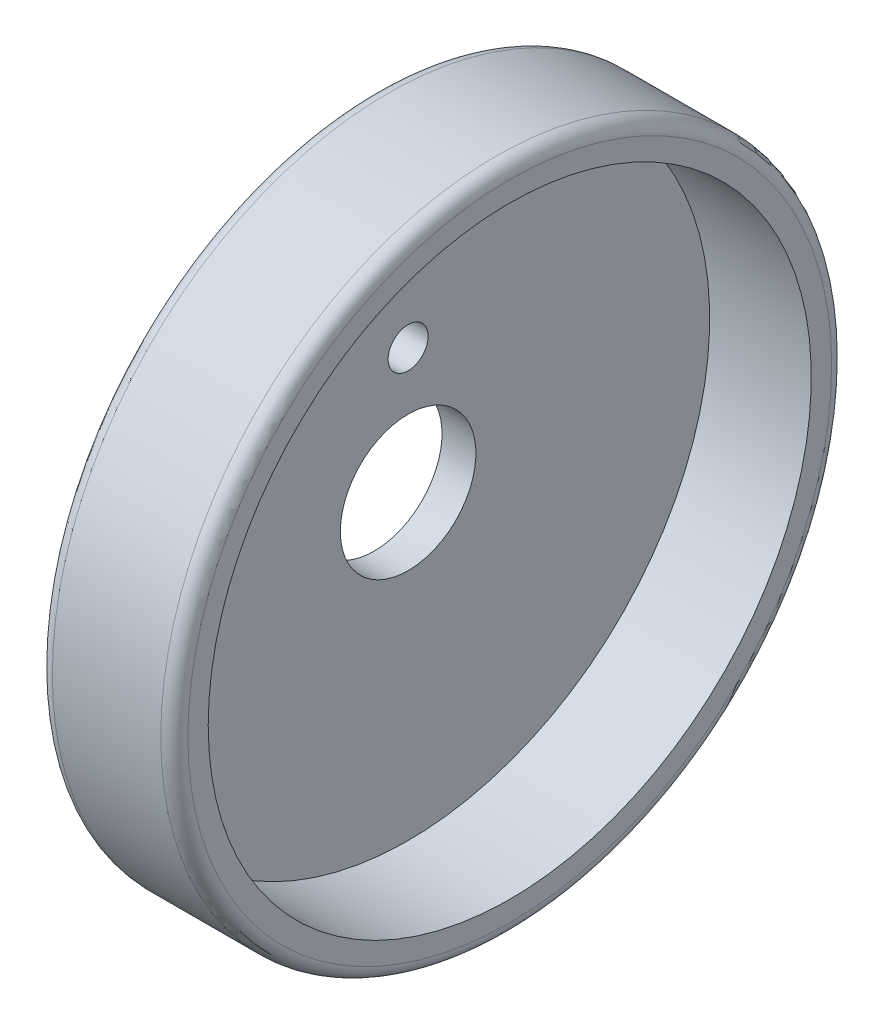
ISO-10303-21;
HEADER;
FILE_DESCRIPTION(('STEP AP214'),'2;1');
FILE_NAME('part.step','',(''),(''),'','','');
FILE_SCHEMA(('AUTOMOTIVE_DESIGN { 1 0 10303 214 1 1 1 1 }'));
ENDSEC;
DATA;
#1=APPLICATION_CONTEXT('core data for automotive mechanical design processes');
#2=APPLICATION_PROTOCOL_DEFINITION('international standard','automotive_design',2000,#1);
#3=PRODUCT_CONTEXT('',#1,'mechanical');
#4=PRODUCT('Part','Part','',(#3));
#5=PRODUCT_RELATED_PRODUCT_CATEGORY('part','',(#4));
#6=PRODUCT_DEFINITION_FORMATION('','',#4);
#7=PRODUCT_DEFINITION_CONTEXT('part definition',#1,'design');
#8=PRODUCT_DEFINITION('design','',#6,#7);
#9=PRODUCT_DEFINITION_SHAPE('','',#8);
#10=(LENGTH_UNIT() NAMED_UNIT(*) SI_UNIT(.MILLI.,.METRE.));
#11=(NAMED_UNIT(*) PLANE_ANGLE_UNIT() SI_UNIT($,.RADIAN.));
#12=(NAMED_UNIT(*) SI_UNIT($,.STERADIAN.) SOLID_ANGLE_UNIT());
#13=UNCERTAINTY_MEASURE_WITH_UNIT(LENGTH_MEASURE(1.E-05),#10,'distance_accuracy_value','');
#14=(GEOMETRIC_REPRESENTATION_CONTEXT(3) GLOBAL_UNCERTAINTY_ASSIGNED_CONTEXT((#13)) GLOBAL_UNIT_ASSIGNED_CONTEXT((#10,
#11,#12)) REPRESENTATION_CONTEXT('',''));
#15=CARTESIAN_POINT('',(0.,0.,0.));
#16=DIRECTION('',(0.,0.,1.));
#17=DIRECTION('',(1.,0.,0.));
#18=AXIS2_PLACEMENT_3D('',#15,#16,#17);
#19=CARTESIAN_POINT('',(-12.309472934473,19.7222222222222,0.));
#20=DIRECTION('',(-1.,0.,0.));
#21=DIRECTION('',(0.,0.,1.));
#22=AXIS2_PLACEMENT_3D('',#19,#20,#21);
#23=PLANE('',#22);
#24=CARTESIAN_POINT('',(-12.309472934473,-29.7777777777778,0.));
#25=DIRECTION('',(-1.,0.,0.));
#26=DIRECTION('',(0.,0.,1.));
#27=AXIS2_PLACEMENT_3D('',#24,#25,#26);
#28=CIRCLE('',#27,47.5);
#29=CARTESIAN_POINT('',(-12.309472934473,-29.7777777777778,47.5));
#30=VERTEX_POINT('',#29);
#31=EDGE_CURVE('E10',#30,#30,#28,.F.);
#32=ORIENTED_EDGE('',*,*,#31,.T.);
#33=EDGE_LOOP('',(#32));
#34=FACE_BOUND('',#33,.T.);
#35=CARTESIAN_POINT('',(-12.309472934473,-29.7777777777778,0.));
#36=DIRECTION('',(-1.,0.,0.));
#37=DIRECTION('',(0.,0.,1.));
#38=AXIS2_PLACEMENT_3D('',#35,#36,#37);
#39=CIRCLE('',#38,44.5);
#40=CARTESIAN_POINT('',(-12.309472934473,-29.7777777777778,44.5));
#41=VERTEX_POINT('',#40);
#42=EDGE_CURVE('E62',#41,#41,#39,.T.);
#43=ORIENTED_EDGE('',*,*,#42,.T.);
#44=EDGE_LOOP('',(#43));
#45=FACE_BOUND('',#44,.T.);
#46=ADVANCED_FACE('F38',(#34,#45),#23,.F.);
#47=CARTESIAN_POINT('',(-53.2788146794937,-29.7777777777778,0.));
#48=DIRECTION('',(-1.,0.,0.));
#49=DIRECTION('',(0.,0.,1.));
#50=AXIS2_PLACEMENT_3D('',#47,#48,#49);
#51=CYLINDRICAL_SURFACE('',#50,44.5);
#52=ORIENTED_EDGE('',*,*,#42,.F.);
#53=EDGE_LOOP('',(#52));
#54=FACE_BOUND('',#53,.T.);
#55=CARTESIAN_POINT('',(-27.309472934473,-29.7777777777778,0.));
#56=DIRECTION('',(-1.,0.,0.));
#57=DIRECTION('',(0.,0.,1.));
#58=AXIS2_PLACEMENT_3D('',#55,#56,#57);
#59=CIRCLE('',#58,44.5);
#60=CARTESIAN_POINT('',(-27.309472934473,-29.7777777777778,44.5));
#61=VERTEX_POINT('',#60);
#62=EDGE_CURVE('E66',#61,#61,#59,.T.);
#63=ORIENTED_EDGE('',*,*,#62,.T.);
#64=EDGE_LOOP('',(#63));
#65=FACE_BOUND('',#64,.T.);
#66=ADVANCED_FACE('F101',(#54,#65),#51,.F.);
#67=CARTESIAN_POINT('',(-27.309472934473,14.7222222222222,0.));
#68=DIRECTION('',(-1.,0.,0.));
#69=DIRECTION('',(0.,0.,1.));
#70=AXIS2_PLACEMENT_3D('',#67,#68,#69);
#71=PLANE('',#70);
#72=CARTESIAN_POINT('',(-27.309472934473,-11.2777777777778,0.));
#73=DIRECTION('',(-1.,0.,0.));
#74=DIRECTION('',(0.,0.,1.));
#75=AXIS2_PLACEMENT_3D('',#72,#73,#74);
#76=CIRCLE('',#75,2.95);
#77=CARTESIAN_POINT('',(-27.309472934473,-11.2777777777778,-2.94999999999998));
#78=VERTEX_POINT('',#77);
#79=EDGE_CURVE('E78',#78,#78,#76,.T.);
#80=ORIENTED_EDGE('',*,*,#79,.T.);
#81=EDGE_LOOP('',(#80));
#82=FACE_BOUND('',#81,.T.);
#83=ORIENTED_EDGE('',*,*,#62,.F.);
#84=EDGE_LOOP('',(#83));
#85=FACE_BOUND('',#84,.T.);
#86=CARTESIAN_POINT('',(-27.309472934473,-29.7777777777778,0.));
#87=DIRECTION('',(-1.,0.,0.));
#88=DIRECTION('',(0.,0.,1.));
#89=AXIS2_PLACEMENT_3D('',#86,#87,#88);
#90=CIRCLE('',#89,10.);
#91=CARTESIAN_POINT('',(-27.309472934473,-29.7777777777778,10.));
#92=VERTEX_POINT('',#91);
#93=EDGE_CURVE('E70',#92,#92,#90,.T.);
#94=ORIENTED_EDGE('',*,*,#93,.T.);
#95=EDGE_LOOP('',(#94));
#96=FACE_BOUND('',#95,.T.);
#97=ADVANCED_FACE('F106',(#82,#85,#96),#71,.F.);
#98=CARTESIAN_POINT('',(-53.2788146794937,-29.7777777777778,0.));
#99=DIRECTION('',(-1.,0.,0.));
#100=DIRECTION('',(0.,0.,1.));
#101=AXIS2_PLACEMENT_3D('',#98,#99,#100);
#102=CYLINDRICAL_SURFACE('',#101,10.);
#103=ORIENTED_EDGE('',*,*,#93,.F.);
#104=EDGE_LOOP('',(#103));
#105=FACE_BOUND('',#104,.T.);
#106=CARTESIAN_POINT('',(-32.309472934473,-29.7777777777778,0.));
#107=DIRECTION('',(-1.,0.,0.));
#108=DIRECTION('',(0.,0.,1.));
#109=AXIS2_PLACEMENT_3D('',#106,#107,#108);
#110=CIRCLE('',#109,10.);
#111=CARTESIAN_POINT('',(-32.309472934473,-29.7777777777778,10.));
#112=VERTEX_POINT('',#111);
#113=EDGE_CURVE('E74',#112,#112,#110,.T.);
#114=ORIENTED_EDGE('',*,*,#113,.T.);
#115=EDGE_LOOP('',(#114));
#116=FACE_BOUND('',#115,.T.);
#117=ADVANCED_FACE('F123',(#105,#116),#102,.F.);
#118=CARTESIAN_POINT('',(-32.309472934473,-19.7777777777778,0.));
#119=DIRECTION('',(1.,0.,0.));
#120=DIRECTION('',(0.,0.,-1.));
#121=AXIS2_PLACEMENT_3D('',#118,#119,#120);
#122=PLANE('',#121);
#123=CARTESIAN_POINT('',(-32.309472934473,-11.2777777777778,0.));
#124=DIRECTION('',(1.,0.,0.));
#125=DIRECTION('',(0.,0.,-1.));
#126=AXIS2_PLACEMENT_3D('',#123,#124,#125);
#127=CIRCLE('',#126,2.95);
#128=CARTESIAN_POINT('',(-32.309472934473,-11.2777777777778,-2.94999999999998));
#129=VERTEX_POINT('',#128);
#130=EDGE_CURVE('E42',#129,#129,#127,.T.);
#131=ORIENTED_EDGE('',*,*,#130,.T.);
#132=EDGE_LOOP('',(#131));
#133=FACE_BOUND('',#132,.T.);
#134=CARTESIAN_POINT('',(-32.309472934473,-29.7777777777778,0.));
#135=DIRECTION('',(1.,0.,0.));
#136=DIRECTION('',(0.,0.,-1.));
#137=AXIS2_PLACEMENT_3D('',#134,#135,#136);
#138=CIRCLE('',#137,47.5);
#139=CARTESIAN_POINT('',(-32.309472934473,-29.7777777777778,-47.5));
#140=VERTEX_POINT('',#139);
#141=EDGE_CURVE('E58',#140,#140,#138,.F.);
#142=ORIENTED_EDGE('',*,*,#141,.T.);
#143=EDGE_LOOP('',(#142));
#144=FACE_BOUND('',#143,.T.);
#145=ORIENTED_EDGE('',*,*,#113,.F.);
#146=EDGE_LOOP('',(#145));
#147=FACE_BOUND('',#146,.T.);
#148=ADVANCED_FACE('F87',(#133,#144,#147),#122,.F.);
#149=CARTESIAN_POINT('',(-53.2788146794937,-29.7777777777778,0.));
#150=DIRECTION('',(-1.,0.,0.));
#151=DIRECTION('',(0.,0.,1.));
#152=AXIS2_PLACEMENT_3D('',#149,#150,#151);
#153=CYLINDRICAL_SURFACE('',#152,49.5);
#154=CARTESIAN_POINT('',(-14.309472934473,-29.7777777777778,0.));
#155=DIRECTION('',(-1.,0.,0.));
#156=DIRECTION('',(0.,0.,1.));
#157=AXIS2_PLACEMENT_3D('',#154,#155,#156);
#158=CIRCLE('',#157,49.5);
#159=CARTESIAN_POINT('',(-14.309472934473,-29.7777777777778,49.5));
#160=VERTEX_POINT('',#159);
#161=EDGE_CURVE('E47',#160,#160,#158,.T.);
#162=ORIENTED_EDGE('',*,*,#161,.T.);
#163=EDGE_LOOP('',(#162));
#164=FACE_BOUND('',#163,.T.);
#165=CARTESIAN_POINT('',(-30.309472934473,-29.7777777777778,0.));
#166=DIRECTION('',(1.,0.,0.));
#167=DIRECTION('',(0.,0.,-1.));
#168=AXIS2_PLACEMENT_3D('',#165,#166,#167);
#169=CIRCLE('',#168,49.5);
#170=CARTESIAN_POINT('',(-30.309472934473,-29.7777777777778,-49.5));
#171=VERTEX_POINT('',#170);
#172=EDGE_CURVE('E52',#171,#171,#169,.T.);
#173=ORIENTED_EDGE('',*,*,#172,.T.);
#174=EDGE_LOOP('',(#173));
#175=FACE_BOUND('',#174,.T.);
#176=ADVANCED_FACE('F112',(#164,#175),#153,.T.);
#177=CARTESIAN_POINT('',(-30.309472934473,-29.7777777777778,0.));
#178=DIRECTION('',(1.,0.,0.));
#179=DIRECTION('',(0.,0.,-1.));
#180=AXIS2_PLACEMENT_3D('',#177,#178,#179);
#181=TOROIDAL_SURFACE('',#180,47.5,2.);
#182=ORIENTED_EDGE('',*,*,#172,.F.);
#183=EDGE_LOOP('',(#182));
#184=FACE_BOUND('',#183,.T.);
#185=ORIENTED_EDGE('',*,*,#141,.F.);
#186=EDGE_LOOP('',(#185));
#187=FACE_BOUND('',#186,.T.);
#188=ADVANCED_FACE('F97',(#184,#187),#181,.T.);
#189=CARTESIAN_POINT('',(-14.309472934473,-29.7777777777778,0.));
#190=DIRECTION('',(-1.,0.,0.));
#191=DIRECTION('',(0.,0.,1.));
#192=AXIS2_PLACEMENT_3D('',#189,#190,#191);
#193=TOROIDAL_SURFACE('',#192,47.5,2.);
#194=ORIENTED_EDGE('',*,*,#31,.F.);
#195=EDGE_LOOP('',(#194));
#196=FACE_BOUND('',#195,.T.);
#197=ORIENTED_EDGE('',*,*,#161,.F.);
#198=EDGE_LOOP('',(#197));
#199=FACE_BOUND('',#198,.T.);
#200=ADVANCED_FACE('F40',(#196,#199),#193,.T.);
#201=CARTESIAN_POINT('',(-40.309472934473,-11.2777777777778,0.));
#202=DIRECTION('',(1.,0.,0.));
#203=DIRECTION('',(0.,0.,-1.));
#204=AXIS2_PLACEMENT_3D('',#201,#202,#203);
#205=CYLINDRICAL_SURFACE('',#204,2.95);
#206=CARTESIAN_POINT('',(-32.309472934473,-11.2777777777778,-2.94999999999998));
#207=CARTESIAN_POINT('',(-32.2573896011396,-11.2777777777778,-2.94999999999998));
#208=CARTESIAN_POINT('',(-32.2053062678063,-11.2777777777778,-2.94999999999998));
#209=CARTESIAN_POINT('',(-32.1011396011396,-11.2777777777778,-2.94999999999998));
#210=CARTESIAN_POINT('',(-32.0490562678063,-11.2777777777778,-2.94999999999998));
#211=CARTESIAN_POINT('',(-31.9448896011396,-11.2777777777778,-2.94999999999998));
#212=CARTESIAN_POINT('',(-31.8928062678063,-11.2777777777778,-2.94999999999998));
#213=CARTESIAN_POINT('',(-31.7886396011396,-11.2777777777778,-2.94999999999998));
#214=CARTESIAN_POINT('',(-31.7365562678063,-11.2777777777778,-2.94999999999998));
#215=CARTESIAN_POINT('',(-31.6323896011396,-11.2777777777778,-2.94999999999998));
#216=CARTESIAN_POINT('',(-31.5803062678063,-11.2777777777778,-2.94999999999998));
#217=CARTESIAN_POINT('',(-31.4761396011396,-11.2777777777778,-2.94999999999998));
#218=CARTESIAN_POINT('',(-31.4240562678063,-11.2777777777778,-2.94999999999998));
#219=CARTESIAN_POINT('',(-31.3198896011396,-11.2777777777778,-2.94999999999998));
#220=CARTESIAN_POINT('',(-31.2678062678063,-11.2777777777778,-2.94999999999998));
#221=CARTESIAN_POINT('',(-31.1636396011396,-11.2777777777778,-2.94999999999998));
#222=CARTESIAN_POINT('',(-31.1115562678063,-11.2777777777778,-2.94999999999998));
#223=CARTESIAN_POINT('',(-31.0073896011396,-11.2777777777778,-2.94999999999998));
#224=CARTESIAN_POINT('',(-30.9553062678063,-11.2777777777778,-2.94999999999998));
#225=CARTESIAN_POINT('',(-30.8511396011396,-11.2777777777778,-2.94999999999998));
#226=CARTESIAN_POINT('',(-30.7990562678063,-11.2777777777778,-2.94999999999998));
#227=CARTESIAN_POINT('',(-30.6948896011396,-11.2777777777778,-2.94999999999998));
#228=CARTESIAN_POINT('',(-30.6428062678063,-11.2777777777778,-2.94999999999998));
#229=CARTESIAN_POINT('',(-30.5386396011396,-11.2777777777778,-2.94999999999998));
#230=CARTESIAN_POINT('',(-30.4865562678063,-11.2777777777778,-2.94999999999998));
#231=CARTESIAN_POINT('',(-30.3823896011396,-11.2777777777778,-2.94999999999998));
#232=CARTESIAN_POINT('',(-30.3303062678063,-11.2777777777778,-2.94999999999998));
#233=CARTESIAN_POINT('',(-30.2261396011396,-11.2777777777778,-2.94999999999998));
#234=CARTESIAN_POINT('',(-30.1740562678063,-11.2777777777778,-2.94999999999998));
#235=CARTESIAN_POINT('',(-30.0698896011396,-11.2777777777778,-2.94999999999998));
#236=CARTESIAN_POINT('',(-30.0178062678063,-11.2777777777778,-2.94999999999998));
#237=CARTESIAN_POINT('',(-29.9136396011396,-11.2777777777778,-2.94999999999998));
#238=CARTESIAN_POINT('',(-29.8615562678063,-11.2777777777778,-2.94999999999998));
#239=CARTESIAN_POINT('',(-29.7573896011396,-11.2777777777778,-2.94999999999998));
#240=CARTESIAN_POINT('',(-29.7053062678063,-11.2777777777778,-2.94999999999998));
#241=CARTESIAN_POINT('',(-29.6011396011396,-11.2777777777778,-2.94999999999998));
#242=CARTESIAN_POINT('',(-29.5490562678063,-11.2777777777778,-2.94999999999998));
#243=CARTESIAN_POINT('',(-29.4448896011396,-11.2777777777778,-2.94999999999998));
#244=CARTESIAN_POINT('',(-29.3928062678063,-11.2777777777778,-2.94999999999998));
#245=CARTESIAN_POINT('',(-29.2886396011396,-11.2777777777778,-2.94999999999998));
#246=CARTESIAN_POINT('',(-29.2365562678063,-11.2777777777778,-2.94999999999998));
#247=CARTESIAN_POINT('',(-29.1323896011396,-11.2777777777778,-2.94999999999998));
#248=CARTESIAN_POINT('',(-29.0803062678063,-11.2777777777778,-2.94999999999998));
#249=CARTESIAN_POINT('',(-28.9761396011396,-11.2777777777778,-2.94999999999998));
#250=CARTESIAN_POINT('',(-28.9240562678063,-11.2777777777778,-2.94999999999998));
#251=CARTESIAN_POINT('',(-28.8198896011396,-11.2777777777778,-2.94999999999998));
#252=CARTESIAN_POINT('',(-28.7678062678063,-11.2777777777778,-2.94999999999998));
#253=CARTESIAN_POINT('',(-28.6636396011396,-11.2777777777778,-2.94999999999998));
#254=CARTESIAN_POINT('',(-28.6115562678063,-11.2777777777778,-2.94999999999998));
#255=CARTESIAN_POINT('',(-28.5073896011396,-11.2777777777778,-2.94999999999998));
#256=CARTESIAN_POINT('',(-28.4553062678063,-11.2777777777778,-2.94999999999998));
#257=CARTESIAN_POINT('',(-28.3511396011396,-11.2777777777778,-2.94999999999998));
#258=CARTESIAN_POINT('',(-28.2990562678063,-11.2777777777778,-2.94999999999998));
#259=CARTESIAN_POINT('',(-28.1948896011396,-11.2777777777778,-2.94999999999998));
#260=CARTESIAN_POINT('',(-28.1428062678063,-11.2777777777778,-2.94999999999998));
#261=CARTESIAN_POINT('',(-28.0386396011396,-11.2777777777778,-2.94999999999998));
#262=CARTESIAN_POINT('',(-27.9865562678063,-11.2777777777778,-2.94999999999998));
#263=CARTESIAN_POINT('',(-27.8823896011396,-11.2777777777778,-2.94999999999998));
#264=CARTESIAN_POINT('',(-27.8303062678063,-11.2777777777778,-2.94999999999998));
#265=CARTESIAN_POINT('',(-27.7261396011396,-11.2777777777778,-2.94999999999998));
#266=CARTESIAN_POINT('',(-27.6740562678063,-11.2777777777778,-2.94999999999998));
#267=CARTESIAN_POINT('',(-27.5698896011396,-11.2777777777778,-2.94999999999998));
#268=CARTESIAN_POINT('',(-27.5178062678063,-11.2777777777778,-2.94999999999998));
#269=CARTESIAN_POINT('',(-27.4136396011396,-11.2777777777778,-2.94999999999998));
#270=CARTESIAN_POINT('',(-27.3615562678063,-11.2777777777778,-2.94999999999998));
#271=CARTESIAN_POINT('',(-27.309472934473,-11.2777777777778,-2.94999999999998));
#272=B_SPLINE_CURVE_WITH_KNOTS('',3,(#206,#207,#208,#209,#210,#211,#212,#213,#214,#215,#216,
#217,#218,#219,#220,#221,#222,#223,#224,#225,#226,#227,#228,#229,#230,#231,#232,#233,#234,#235,
#236,#237,#238,#239,#240,#241,#242,#243,#244,#245,#246,#247,#248,#249,#250,#251,#252,#253,#254,
#255,#256,#257,#258,#259,#260,#261,#262,#263,#264,#265,#266,#267,#268,#269,#270,#271),
.UNSPECIFIED.,.F.,.F.,(4,2,2,2,2,2,2,2,2,2,2,2,2,2,2,2,2,2,2,2,2,2,2,2,2,2,2,2,2,2,2,2,4),(0.,
0.156249999999997,0.3125,0.468749999999997,0.625000000000001,0.781249999999997,
0.937500000000001,1.09375,1.25,1.40625,1.5625,1.71875,1.875,2.03125,2.1875,2.34375,2.5,2.65625,
2.8125,2.96875,3.125,3.28125,3.4375,3.59375,3.75,3.90625,4.0625,4.21875,4.375,4.53125,4.6875,
4.84375,5.),.UNSPECIFIED.);
#273=EDGE_CURVE('BSEAM90',#129,#78,#272,.T.);
#274=ORIENTED_EDGE('',*,*,#130,.F.);
#275=ORIENTED_EDGE('',*,*,#79,.F.);
#276=ORIENTED_EDGE('',*,*,#273,.T.);
#277=ORIENTED_EDGE('',*,*,#273,.F.);
#278=EDGE_LOOP('',(#274,#276,#275,#277));
#279=FACE_BOUND('',#278,.T.);
#280=ADVANCED_FACE('F90',(#279),#205,.F.);
#281=CLOSED_SHELL('',(#46,#66,#97,#117,#148,#176,#188,#200,#280));
#282=MANIFOLD_SOLID_BREP('B2',#281);
#283=ADVANCED_BREP_SHAPE_REPRESENTATION('',(#18,#282),#14);
#284=SHAPE_DEFINITION_REPRESENTATION(#9,#283);
ENDSEC;
END-ISO-10303-21;
